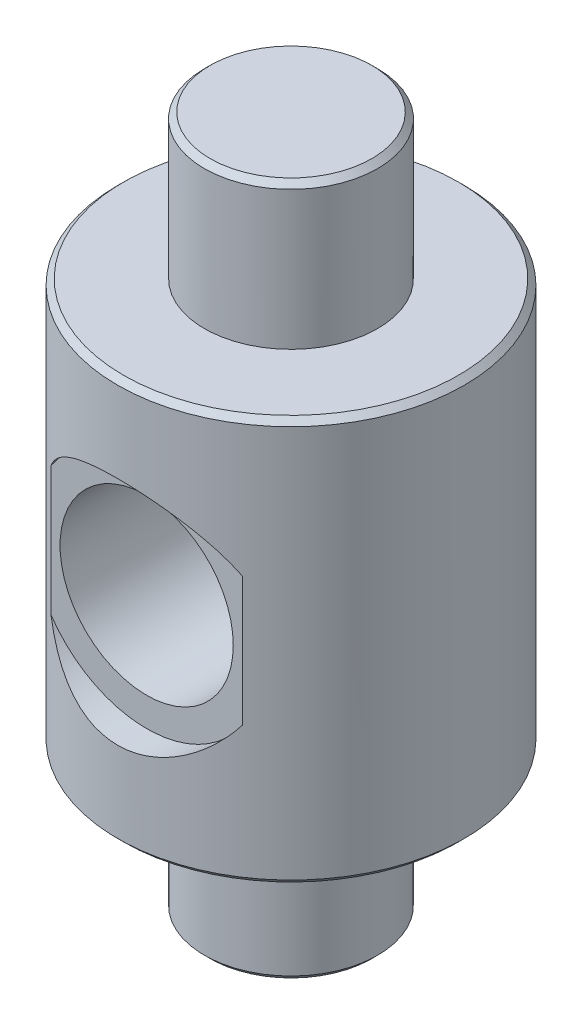
ISO-10303-21;
HEADER;
FILE_DESCRIPTION(('STEP AP214'),'2;1');
FILE_NAME('part.step','',(''),(''),'','','');
FILE_SCHEMA(('AUTOMOTIVE_DESIGN { 1 0 10303 214 1 1 1 1 }'));
ENDSEC;
DATA;
#1=APPLICATION_CONTEXT('core data for automotive mechanical design processes');
#2=APPLICATION_PROTOCOL_DEFINITION('international standard','automotive_design',2000,#1);
#3=PRODUCT_CONTEXT('',#1,'mechanical');
#4=PRODUCT('Part','Part','',(#3));
#5=PRODUCT_RELATED_PRODUCT_CATEGORY('part','',(#4));
#6=PRODUCT_DEFINITION_FORMATION('','',#4);
#7=PRODUCT_DEFINITION_CONTEXT('part definition',#1,'design');
#8=PRODUCT_DEFINITION('design','',#6,#7);
#9=PRODUCT_DEFINITION_SHAPE('','',#8);
#10=(LENGTH_UNIT() NAMED_UNIT(*) SI_UNIT(.MILLI.,.METRE.));
#11=(NAMED_UNIT(*) PLANE_ANGLE_UNIT() SI_UNIT($,.RADIAN.));
#12=(NAMED_UNIT(*) SI_UNIT($,.STERADIAN.) SOLID_ANGLE_UNIT());
#13=UNCERTAINTY_MEASURE_WITH_UNIT(LENGTH_MEASURE(1.E-05),#10,'distance_accuracy_value','');
#14=(GEOMETRIC_REPRESENTATION_CONTEXT(3) GLOBAL_UNCERTAINTY_ASSIGNED_CONTEXT((#13)) GLOBAL_UNIT_ASSIGNED_CONTEXT((#10,
#11,#12)) REPRESENTATION_CONTEXT('',''));
#15=CARTESIAN_POINT('',(0.,0.,0.));
#16=DIRECTION('',(0.,0.,1.));
#17=DIRECTION('',(1.,0.,0.));
#18=AXIS2_PLACEMENT_3D('',#15,#16,#17);
#19=CARTESIAN_POINT('',(0.,0.,0.));
#20=DIRECTION('',(0.,-1.,0.));
#21=DIRECTION('',(0.,0.,-1.));
#22=AXIS2_PLACEMENT_3D('',#19,#20,#21);
#23=CYLINDRICAL_SURFACE('',#22,3.);
#24=CARTESIAN_POINT('',(0.,2.6,0.));
#25=DIRECTION('',(0.,-1.,0.));
#26=DIRECTION('',(0.,0.,-1.));
#27=AXIS2_PLACEMENT_3D('',#24,#25,#26);
#28=CIRCLE('',#27,3.);
#29=CARTESIAN_POINT('',(0.,2.6,-3.));
#30=VERTEX_POINT('',#29);
#31=EDGE_CURVE('E113',#30,#30,#28,.F.);
#32=ORIENTED_EDGE('',*,*,#31,.T.);
#33=EDGE_LOOP('',(#32));
#34=FACE_BOUND('',#33,.T.);
#35=CARTESIAN_POINT('',(0.,9.4,0.));
#36=DIRECTION('',(0.,1.,0.));
#37=DIRECTION('',(0.,0.,1.));
#38=AXIS2_PLACEMENT_3D('',#35,#36,#37);
#39=CIRCLE('',#38,3.);
#40=CARTESIAN_POINT('',(0.,9.4,3.));
#41=VERTEX_POINT('',#40);
#42=EDGE_CURVE('E110',#41,#41,#39,.F.);
#43=ORIENTED_EDGE('',*,*,#42,.T.);
#44=EDGE_LOOP('',(#43));
#45=FACE_BOUND('',#44,.T.);
#46=CARTESIAN_POINT('',(-1.6583123951777,4.88196601125011,2.5));
#47=CARTESIAN_POINT('',(-1.62588041682893,4.83388174951264,2.52151479876285));
#48=CARTESIAN_POINT('',(-1.59147775995563,4.78734838879081,2.54342347636609));
#49=CARTESIAN_POINT('',(-1.51881718972826,4.69748455207734,2.5874697531549));
#50=CARTESIAN_POINT('',(-1.48055809930373,4.65415506101724,2.60960742037181));
#51=CARTESIAN_POINT('',(-1.35957897250648,4.52856680233055,2.67582114663101));
#52=CARTESIAN_POINT('',(-1.27112677213644,4.45140473959464,2.71937159504119));
#53=CARTESIAN_POINT('',(-1.08001742837921,4.31252958225246,2.80078430015006));
#54=CARTESIAN_POINT('',(-0.977318184431943,4.25086385700159,2.83862897767655));
#55=CARTESIAN_POINT('',(-0.760170773384896,4.14620224628185,2.90429124381123));
#56=CARTESIAN_POINT('',(-0.645766459364156,4.103139618855,2.93214461594087));
#57=CARTESIAN_POINT('',(-0.42245729889637,4.04211006134393,2.97201413865436));
#58=CARTESIAN_POINT('',(-0.314455876194935,4.02181009129021,2.98549347454722));
#59=CARTESIAN_POINT('',(-0.0957318708440063,3.99927723884014,3.00046894125686));
#60=CARTESIAN_POINT('',(0.0149896939065672,3.99703769834788,3.00196948813079));
#61=CARTESIAN_POINT('',(0.219788899237258,4.00983152656241,2.99345292695804));
#62=CARTESIAN_POINT('',(0.314087916632492,4.02256428894883,2.98496974119453));
#63=CARTESIAN_POINT('',(0.498831374402182,4.06091145766797,2.95970537418975));
#64=CARTESIAN_POINT('',(0.589276397828324,4.08652390793745,2.94292545299631));
#65=CARTESIAN_POINT('',(0.766037685544138,4.15008299698925,2.90199776264025));
#66=CARTESIAN_POINT('',(0.852235141290288,4.18826615536471,2.87770930064207));
#67=CARTESIAN_POINT('',(1.01715798189846,4.27544067615506,2.8236387306717));
#68=CARTESIAN_POINT('',(1.09587569901238,4.32444296225357,2.79385107537834));
#69=CARTESIAN_POINT('',(1.25565427239454,4.43974414257662,2.72615287516341));
#70=CARTESIAN_POINT('',(1.33541158103129,4.50751898370635,2.68769051048631));
#71=CARTESIAN_POINT('',(1.48295801527083,4.65403199592482,2.60917581519461));
#72=CARTESIAN_POINT('',(1.55076586541565,4.73275266247985,2.56912609477701));
#73=CARTESIAN_POINT('',(1.62799531219028,4.83795848005763,2.51991822969558));
#74=CARTESIAN_POINT('',(1.64336841165434,4.85980271753446,2.5099145043454));
#75=CARTESIAN_POINT('',(1.6583123951777,4.88196601125011,2.5));
#76=B_SPLINE_CURVE_WITH_KNOTS('',3,(#46,#47,#48,#49,#50,#51,#52,#53,#54,#55,#56,#57,#58,#59,#60,
#61,#62,#63,#64,#65,#66,#67,#68,#69,#70,#71,#72,#73,#74,#75),.UNSPECIFIED.,.F.,.F.,(4,2,2,2,2,2,
2,2,2,2,2,2,2,2,4),(0.,0.185463815245249,0.370984410633051,0.744697847347586,1.1195401269487,
1.49302619268151,1.82315350216072,2.1531591024743,2.43842427846838,2.72364614376402,
3.01457448418865,3.30579791879389,3.6390815214847,3.97183814013364,4.05738621739483),.UNSPECIFIED.);
#77=CARTESIAN_POINT('',(-1.6583123951777,4.88196601125011,2.5));
#78=VERTEX_POINT('',#77);
#79=CARTESIAN_POINT('',(1.6583123951777,4.88196601125011,2.5));
#80=VERTEX_POINT('',#79);
#81=EDGE_CURVE('E163',#78,#80,#76,.T.);
#82=ORIENTED_EDGE('',*,*,#81,.F.);
#83=DIRECTION('',(0.,-1.,0.));
#84=VECTOR('',#83,1.);
#85=CARTESIAN_POINT('',(-1.6583123951777,0.,2.5));
#86=LINE('',#85,#84);
#87=CARTESIAN_POINT('',(-1.6583123951777,7.11803398874989,2.5));
#88=VERTEX_POINT('',#87);
#89=EDGE_CURVE('E176',#78,#88,#86,.F.);
#90=ORIENTED_EDGE('',*,*,#89,.T.);
#91=CARTESIAN_POINT('',(1.6583123951777,7.11803398874989,2.5));
#92=CARTESIAN_POINT('',(1.62588041682893,7.16611825048736,2.52151479876285));
#93=CARTESIAN_POINT('',(1.59147775995563,7.21265161120919,2.54342347636609));
#94=CARTESIAN_POINT('',(1.51881718972826,7.30251544792266,2.5874697531549));
#95=CARTESIAN_POINT('',(1.48055809930373,7.34584493898276,2.60960742037181));
#96=CARTESIAN_POINT('',(1.35957897250648,7.47143319766945,2.67582114663101));
#97=CARTESIAN_POINT('',(1.27112677213644,7.54859526040536,2.71937159504119));
#98=CARTESIAN_POINT('',(1.08001742837921,7.68747041774754,2.80078430015006));
#99=CARTESIAN_POINT('',(0.977318184431943,7.74913614299841,2.83862897767655));
#100=CARTESIAN_POINT('',(0.760170773384897,7.85379775371815,2.90429124381123));
#101=CARTESIAN_POINT('',(0.645766459364157,7.896860381145,2.93214461594087));
#102=CARTESIAN_POINT('',(0.422457298896371,7.95788993865607,2.97201413865436));
#103=CARTESIAN_POINT('',(0.314455876194935,7.97818990870978,2.98549347454722));
#104=CARTESIAN_POINT('',(0.0957318708440068,8.00072276115986,3.00046894125686));
#105=CARTESIAN_POINT('',(-0.0149896939065668,8.00296230165212,3.00196948813079));
#106=CARTESIAN_POINT('',(-0.219788899237258,7.9901684734376,2.99345292695804));
#107=CARTESIAN_POINT('',(-0.314087916632492,7.97743571105117,2.98496974119453));
#108=CARTESIAN_POINT('',(-0.498831374402183,7.93908854233203,2.95970537418975));
#109=CARTESIAN_POINT('',(-0.589276397828325,7.91347609206255,2.94292545299631));
#110=CARTESIAN_POINT('',(-0.766037685544138,7.84991700301075,2.90199776264025));
#111=CARTESIAN_POINT('',(-0.852235141290288,7.81173384463529,2.87770930064207));
#112=CARTESIAN_POINT('',(-1.01715798189846,7.72455932384494,2.8236387306717));
#113=CARTESIAN_POINT('',(-1.09587569901238,7.67555703774643,2.79385107537834));
#114=CARTESIAN_POINT('',(-1.25565427239454,7.56025585742338,2.72615287516341));
#115=CARTESIAN_POINT('',(-1.33541158103129,7.49248101629365,2.68769051048631));
#116=CARTESIAN_POINT('',(-1.48295801527083,7.34596800407518,2.60917581519461));
#117=CARTESIAN_POINT('',(-1.55076586541565,7.26724733752015,2.56912609477701));
#118=CARTESIAN_POINT('',(-1.62799531219028,7.16204151994237,2.51991822969558));
#119=CARTESIAN_POINT('',(-1.64336841165434,7.14019728246554,2.5099145043454));
#120=CARTESIAN_POINT('',(-1.6583123951777,7.11803398874989,2.5));
#121=B_SPLINE_CURVE_WITH_KNOTS('',3,(#91,#92,#93,#94,#95,#96,#97,#98,#99,#100,#101,#102,#103,
#104,#105,#106,#107,#108,#109,#110,#111,#112,#113,#114,#115,#116,#117,#118,#119,#120),
.UNSPECIFIED.,.F.,.F.,(4,2,2,2,2,2,2,2,2,2,2,2,2,2,4),(0.,0.185463815245249,0.370984410633051,
0.744697847347586,1.1195401269487,1.49302619268151,1.82315350216072,2.1531591024743,
2.43842427846838,2.72364614376402,3.01457448418865,3.30579791879389,3.6390815214847,
3.97183814013364,4.05738621739483),.UNSPECIFIED.);
#122=CARTESIAN_POINT('',(1.6583123951777,7.11803398874989,2.5));
#123=VERTEX_POINT('',#122);
#124=EDGE_CURVE('E154',#123,#88,#121,.T.);
#125=ORIENTED_EDGE('',*,*,#124,.F.);
#126=DIRECTION('',(0.,-1.,0.));
#127=VECTOR('',#126,1.);
#128=CARTESIAN_POINT('',(1.6583123951777,0.,2.5));
#129=LINE('',#128,#127);
#130=EDGE_CURVE('E340',#123,#80,#129,.T.);
#131=ORIENTED_EDGE('',*,*,#130,.T.);
#132=EDGE_LOOP('',(#82,#90,#125,#131));
#133=FACE_BOUND('',#132,.T.);
#134=DIRECTION('',(0.,-1.,0.));
#135=VECTOR('',#134,1.);
#136=CARTESIAN_POINT('',(1.6583123951777,0.,-2.5));
#137=LINE('',#136,#135);
#138=CARTESIAN_POINT('',(1.6583123951777,4.88196601125011,-2.5));
#139=VERTEX_POINT('',#138);
#140=CARTESIAN_POINT('',(1.6583123951777,7.11803398874989,-2.5));
#141=VERTEX_POINT('',#140);
#142=EDGE_CURVE('E91',#139,#141,#137,.F.);
#143=ORIENTED_EDGE('',*,*,#142,.T.);
#144=CARTESIAN_POINT('',(1.6583123951777,7.11803398874989,-2.5));
#145=CARTESIAN_POINT('',(1.62588041682893,7.16611825048736,-2.52151479876285));
#146=CARTESIAN_POINT('',(1.59147775995563,7.21265161120919,-2.54342347636609));
#147=CARTESIAN_POINT('',(1.51881718972826,7.30251544792266,-2.5874697531549));
#148=CARTESIAN_POINT('',(1.48055809930373,7.34584493898276,-2.60960742037181));
#149=CARTESIAN_POINT('',(1.35957897250648,7.47143319766945,-2.67582114663101));
#150=CARTESIAN_POINT('',(1.27112677213644,7.54859526040536,-2.71937159504119));
#151=CARTESIAN_POINT('',(1.08001742837921,7.68747041774754,-2.80078430015006));
#152=CARTESIAN_POINT('',(0.977318184431943,7.74913614299841,-2.83862897767655));
#153=CARTESIAN_POINT('',(0.760170773384897,7.85379775371815,-2.90429124381123));
#154=CARTESIAN_POINT('',(0.645766459364157,7.896860381145,-2.93214461594087));
#155=CARTESIAN_POINT('',(0.422457298896371,7.95788993865607,-2.97201413865436));
#156=CARTESIAN_POINT('',(0.314455876194935,7.97818990870978,-2.98549347454722));
#157=CARTESIAN_POINT('',(0.0957318708440068,8.00072276115986,-3.00046894125686));
#158=CARTESIAN_POINT('',(-0.0149896939065668,8.00296230165212,-3.00196948813079));
#159=CARTESIAN_POINT('',(-0.219788899237258,7.9901684734376,-2.99345292695804));
#160=CARTESIAN_POINT('',(-0.314087916632492,7.97743571105117,-2.98496974119453));
#161=CARTESIAN_POINT('',(-0.498831374402183,7.93908854233203,-2.95970537418975));
#162=CARTESIAN_POINT('',(-0.589276397828325,7.91347609206255,-2.94292545299631));
#163=CARTESIAN_POINT('',(-0.766037685544138,7.84991700301075,-2.90199776264025));
#164=CARTESIAN_POINT('',(-0.852235141290288,7.81173384463529,-2.87770930064207));
#165=CARTESIAN_POINT('',(-1.01715798189846,7.72455932384494,-2.8236387306717));
#166=CARTESIAN_POINT('',(-1.09587569901238,7.67555703774643,-2.79385107537834));
#167=CARTESIAN_POINT('',(-1.25565427239454,7.56025585742338,-2.72615287516341));
#168=CARTESIAN_POINT('',(-1.33541158103129,7.49248101629365,-2.68769051048631));
#169=CARTESIAN_POINT('',(-1.48295801527083,7.34596800407518,-2.60917581519461));
#170=CARTESIAN_POINT('',(-1.55076586541565,7.26724733752015,-2.56912609477701));
#171=CARTESIAN_POINT('',(-1.62799531219028,7.16204151994237,-2.51991822969558));
#172=CARTESIAN_POINT('',(-1.64336841165434,7.14019728246554,-2.5099145043454));
#173=CARTESIAN_POINT('',(-1.6583123951777,7.11803398874989,-2.5));
#174=B_SPLINE_CURVE_WITH_KNOTS('',3,(#144,#145,#146,#147,#148,#149,#150,#151,#152,#153,#154,
#155,#156,#157,#158,#159,#160,#161,#162,#163,#164,#165,#166,#167,#168,#169,#170,#171,#172,#173),
.UNSPECIFIED.,.F.,.F.,(4,2,2,2,2,2,2,2,2,2,2,2,2,2,4),(0.,0.185463815245249,0.370984410633051,
0.744697847347586,1.1195401269487,1.49302619268151,1.82315350216072,2.1531591024743,
2.43842427846838,2.72364614376402,3.01457448418865,3.30579791879389,3.6390815214847,
3.97183814013364,4.05738621739483),.UNSPECIFIED.);
#175=CARTESIAN_POINT('',(-1.6583123951777,7.11803398874989,-2.5));
#176=VERTEX_POINT('',#175);
#177=EDGE_CURVE('E80',#141,#176,#174,.T.);
#178=ORIENTED_EDGE('',*,*,#177,.T.);
#179=DIRECTION('',(0.,-1.,0.));
#180=VECTOR('',#179,1.);
#181=CARTESIAN_POINT('',(-1.6583123951777,0.,-2.5));
#182=LINE('',#181,#180);
#183=CARTESIAN_POINT('',(-1.6583123951777,4.88196601125011,-2.5));
#184=VERTEX_POINT('',#183);
#185=EDGE_CURVE('E87',#176,#184,#182,.T.);
#186=ORIENTED_EDGE('',*,*,#185,.T.);
#187=CARTESIAN_POINT('',(-1.6583123951777,4.88196601125011,-2.5));
#188=CARTESIAN_POINT('',(-1.62588041682893,4.83388174951264,-2.52151479876285));
#189=CARTESIAN_POINT('',(-1.59147775995563,4.78734838879081,-2.54342347636609));
#190=CARTESIAN_POINT('',(-1.51881718972826,4.69748455207734,-2.5874697531549));
#191=CARTESIAN_POINT('',(-1.48055809930373,4.65415506101724,-2.60960742037181));
#192=CARTESIAN_POINT('',(-1.35957897250648,4.52856680233055,-2.67582114663101));
#193=CARTESIAN_POINT('',(-1.27112677213644,4.45140473959464,-2.71937159504119));
#194=CARTESIAN_POINT('',(-1.08001742837921,4.31252958225246,-2.80078430015006));
#195=CARTESIAN_POINT('',(-0.977318184431943,4.25086385700159,-2.83862897767655));
#196=CARTESIAN_POINT('',(-0.760170773384896,4.14620224628185,-2.90429124381123));
#197=CARTESIAN_POINT('',(-0.645766459364156,4.103139618855,-2.93214461594087));
#198=CARTESIAN_POINT('',(-0.42245729889637,4.04211006134393,-2.97201413865436));
#199=CARTESIAN_POINT('',(-0.314455876194935,4.02181009129021,-2.98549347454722));
#200=CARTESIAN_POINT('',(-0.0957318708440063,3.99927723884014,-3.00046894125686));
#201=CARTESIAN_POINT('',(0.0149896939065672,3.99703769834788,-3.00196948813079));
#202=CARTESIAN_POINT('',(0.219788899237258,4.00983152656241,-2.99345292695804));
#203=CARTESIAN_POINT('',(0.314087916632492,4.02256428894883,-2.98496974119453));
#204=CARTESIAN_POINT('',(0.498831374402182,4.06091145766797,-2.95970537418975));
#205=CARTESIAN_POINT('',(0.589276397828324,4.08652390793745,-2.94292545299631));
#206=CARTESIAN_POINT('',(0.766037685544138,4.15008299698925,-2.90199776264025));
#207=CARTESIAN_POINT('',(0.852235141290288,4.18826615536471,-2.87770930064207));
#208=CARTESIAN_POINT('',(1.01715798189846,4.27544067615506,-2.8236387306717));
#209=CARTESIAN_POINT('',(1.09587569901238,4.32444296225357,-2.79385107537834));
#210=CARTESIAN_POINT('',(1.25565427239454,4.43974414257662,-2.72615287516341));
#211=CARTESIAN_POINT('',(1.33541158103129,4.50751898370635,-2.68769051048631));
#212=CARTESIAN_POINT('',(1.48295801527083,4.65403199592482,-2.60917581519461));
#213=CARTESIAN_POINT('',(1.55076586541565,4.73275266247985,-2.56912609477701));
#214=CARTESIAN_POINT('',(1.62799531219028,4.83795848005763,-2.51991822969558));
#215=CARTESIAN_POINT('',(1.64336841165434,4.85980271753446,-2.5099145043454));
#216=CARTESIAN_POINT('',(1.6583123951777,4.88196601125011,-2.5));
#217=B_SPLINE_CURVE_WITH_KNOTS('',3,(#187,#188,#189,#190,#191,#192,#193,#194,#195,#196,#197,
#198,#199,#200,#201,#202,#203,#204,#205,#206,#207,#208,#209,#210,#211,#212,#213,#214,#215,#216),
.UNSPECIFIED.,.F.,.F.,(4,2,2,2,2,2,2,2,2,2,2,2,2,2,4),(0.,0.185463815245249,0.370984410633051,
0.744697847347586,1.1195401269487,1.49302619268151,1.82315350216072,2.1531591024743,
2.43842427846838,2.72364614376402,3.01457448418865,3.30579791879389,3.6390815214847,
3.97183814013364,4.05738621739483),.UNSPECIFIED.);
#218=EDGE_CURVE('E50',#184,#139,#217,.T.);
#219=ORIENTED_EDGE('',*,*,#218,.T.);
#220=EDGE_LOOP('',(#143,#178,#186,#219));
#221=FACE_BOUND('',#220,.T.);
#222=ADVANCED_FACE('F35',(#34,#45,#133,#221),#23,.T.);
#223=CARTESIAN_POINT('',(1.5,0.,0.));
#224=DIRECTION('',(0.,-1.,0.));
#225=DIRECTION('',(0.,0.,-1.));
#226=AXIS2_PLACEMENT_3D('',#223,#224,#225);
#227=PLANE('',#226);
#228=CARTESIAN_POINT('',(0.,0.,0.));
#229=DIRECTION('',(0.,-1.,0.));
#230=DIRECTION('',(0.,0.,-1.));
#231=AXIS2_PLACEMENT_3D('',#228,#229,#230);
#232=CIRCLE('',#231,1.4);
#233=CARTESIAN_POINT('',(0.,0.,-1.4));
#234=VERTEX_POINT('',#233);
#235=EDGE_CURVE('E94',#234,#234,#232,.T.);
#236=ORIENTED_EDGE('',*,*,#235,.T.);
#237=EDGE_LOOP('',(#236));
#238=FACE_BOUND('',#237,.T.);
#239=ADVANCED_FACE('F134',(#238),#227,.T.);
#240=CARTESIAN_POINT('',(0.,12.,0.));
#241=DIRECTION('',(0.,1.,0.));
#242=DIRECTION('',(0.,0.,1.));
#243=AXIS2_PLACEMENT_3D('',#240,#241,#242);
#244=PLANE('',#243);
#245=CARTESIAN_POINT('',(0.,12.,0.));
#246=DIRECTION('',(0.,1.,0.));
#247=DIRECTION('',(0.,0.,1.));
#248=AXIS2_PLACEMENT_3D('',#245,#246,#247);
#249=CIRCLE('',#248,1.4);
#250=CARTESIAN_POINT('',(0.,12.,1.4));
#251=VERTEX_POINT('',#250);
#252=EDGE_CURVE('E11',#251,#251,#249,.T.);
#253=ORIENTED_EDGE('',*,*,#252,.T.);
#254=EDGE_LOOP('',(#253));
#255=FACE_BOUND('',#254,.T.);
#256=ADVANCED_FACE('F140',(#255),#244,.T.);
#257=CARTESIAN_POINT('',(0.,0.,0.));
#258=DIRECTION('',(0.,-1.,0.));
#259=DIRECTION('',(0.,0.,-1.));
#260=AXIS2_PLACEMENT_3D('',#257,#258,#259);
#261=CYLINDRICAL_SURFACE('',#260,1.5);
#262=CARTESIAN_POINT('',(0.,11.9,0.));
#263=DIRECTION('',(0.,1.,0.));
#264=DIRECTION('',(0.,0.,1.));
#265=AXIS2_PLACEMENT_3D('',#262,#263,#264);
#266=CIRCLE('',#265,1.5);
#267=CARTESIAN_POINT('',(0.,11.9,1.5));
#268=VERTEX_POINT('',#267);
#269=EDGE_CURVE('E44',#268,#268,#266,.F.);
#270=ORIENTED_EDGE('',*,*,#269,.T.);
#271=EDGE_LOOP('',(#270));
#272=FACE_BOUND('',#271,.T.);
#273=CARTESIAN_POINT('',(0.,9.5,0.));
#274=DIRECTION('',(0.,-1.,0.));
#275=DIRECTION('',(0.,0.,-1.));
#276=AXIS2_PLACEMENT_3D('',#273,#274,#275);
#277=CIRCLE('',#276,1.5);
#278=CARTESIAN_POINT('',(0.,9.5,-1.5));
#279=VERTEX_POINT('',#278);
#280=EDGE_CURVE('E212',#279,#279,#277,.T.);
#281=ORIENTED_EDGE('',*,*,#280,.F.);
#282=EDGE_LOOP('',(#281));
#283=FACE_BOUND('',#282,.T.);
#284=ADVANCED_FACE('F121',(#272,#283),#261,.T.);
#285=CARTESIAN_POINT('',(1.5,9.5,0.));
#286=DIRECTION('',(0.,1.,0.));
#287=DIRECTION('',(0.,0.,1.));
#288=AXIS2_PLACEMENT_3D('',#285,#286,#287);
#289=PLANE('',#288);
#290=CARTESIAN_POINT('',(0.,9.5,0.));
#291=DIRECTION('',(0.,1.,0.));
#292=DIRECTION('',(0.,0.,1.));
#293=AXIS2_PLACEMENT_3D('',#290,#291,#292);
#294=CIRCLE('',#293,2.9);
#295=CARTESIAN_POINT('',(0.,9.5,2.9));
#296=VERTEX_POINT('',#295);
#297=EDGE_CURVE('E116',#296,#296,#294,.T.);
#298=ORIENTED_EDGE('',*,*,#297,.T.);
#299=EDGE_LOOP('',(#298));
#300=FACE_BOUND('',#299,.T.);
#301=ORIENTED_EDGE('',*,*,#280,.T.);
#302=EDGE_LOOP('',(#301));
#303=FACE_BOUND('',#302,.T.);
#304=ADVANCED_FACE('F149',(#300,#303),#289,.T.);
#305=CARTESIAN_POINT('',(3.,2.5,0.));
#306=DIRECTION('',(0.,-1.,0.));
#307=DIRECTION('',(0.,0.,-1.));
#308=AXIS2_PLACEMENT_3D('',#305,#306,#307);
#309=PLANE('',#308);
#310=CARTESIAN_POINT('',(0.,2.5,0.));
#311=DIRECTION('',(0.,-1.,0.));
#312=DIRECTION('',(0.,0.,-1.));
#313=AXIS2_PLACEMENT_3D('',#310,#311,#312);
#314=CIRCLE('',#313,2.9);
#315=CARTESIAN_POINT('',(0.,2.5,-2.9));
#316=VERTEX_POINT('',#315);
#317=EDGE_CURVE('E107',#316,#316,#314,.T.);
#318=ORIENTED_EDGE('',*,*,#317,.T.);
#319=EDGE_LOOP('',(#318));
#320=FACE_BOUND('',#319,.T.);
#321=CARTESIAN_POINT('',(0.,2.5,0.));
#322=DIRECTION('',(0.,-1.,0.));
#323=DIRECTION('',(0.,0.,-1.));
#324=AXIS2_PLACEMENT_3D('',#321,#322,#323);
#325=CIRCLE('',#324,1.5);
#326=CARTESIAN_POINT('',(0.,2.5,-1.5));
#327=VERTEX_POINT('',#326);
#328=EDGE_CURVE('E210',#327,#327,#325,.T.);
#329=ORIENTED_EDGE('',*,*,#328,.F.);
#330=EDGE_LOOP('',(#329));
#331=FACE_BOUND('',#330,.T.);
#332=ADVANCED_FACE('F147',(#320,#331),#309,.T.);
#333=CARTESIAN_POINT('',(0.,0.,0.));
#334=DIRECTION('',(0.,-1.,0.));
#335=DIRECTION('',(0.,0.,-1.));
#336=AXIS2_PLACEMENT_3D('',#333,#334,#335);
#337=CYLINDRICAL_SURFACE('',#336,1.5);
#338=CARTESIAN_POINT('',(0.,0.0999999999999985,0.));
#339=DIRECTION('',(0.,-1.,0.));
#340=DIRECTION('',(0.,0.,-1.));
#341=AXIS2_PLACEMENT_3D('',#338,#339,#340);
#342=CIRCLE('',#341,1.5);
#343=CARTESIAN_POINT('',(0.,0.0999999999999985,-1.5));
#344=VERTEX_POINT('',#343);
#345=EDGE_CURVE('E97',#344,#344,#342,.F.);
#346=ORIENTED_EDGE('',*,*,#345,.T.);
#347=EDGE_LOOP('',(#346));
#348=FACE_BOUND('',#347,.T.);
#349=ORIENTED_EDGE('',*,*,#328,.T.);
#350=EDGE_LOOP('',(#349));
#351=FACE_BOUND('',#350,.T.);
#352=ADVANCED_FACE('F196',(#348,#351),#337,.T.);
#353=CARTESIAN_POINT('',(0.,6.,2.5));
#354=DIRECTION('',(0.,0.,1.));
#355=DIRECTION('',(1.,0.,0.));
#356=AXIS2_PLACEMENT_3D('',#353,#354,#355);
#357=CYLINDRICAL_SURFACE('',#356,2.);
#358=CARTESIAN_POINT('',(0.,6.,2.5));
#359=DIRECTION('',(0.,0.,1.));
#360=DIRECTION('',(1.,0.,0.));
#361=AXIS2_PLACEMENT_3D('',#358,#359,#360);
#362=CIRCLE('',#361,2.);
#363=EDGE_CURVE('E58',#78,#80,#362,.T.);
#364=ORIENTED_EDGE('',*,*,#363,.F.);
#365=ORIENTED_EDGE('',*,*,#81,.T.);
#366=EDGE_LOOP('',(#364,#365));
#367=FACE_BOUND('',#366,.T.);
#368=ADVANCED_FACE('F194',(#367),#357,.F.);
#369=EDGE_CURVE('E213',#123,#88,#362,.T.);
#370=ORIENTED_EDGE('',*,*,#369,.F.);
#371=ORIENTED_EDGE('',*,*,#124,.T.);
#372=EDGE_LOOP('',(#370,#371));
#373=FACE_BOUND('',#372,.T.);
#374=ADVANCED_FACE('F190',(#373),#357,.F.);
#375=CARTESIAN_POINT('',(0.,6.,2.5));
#376=DIRECTION('',(0.,0.,1.));
#377=DIRECTION('',(1.,0.,0.));
#378=AXIS2_PLACEMENT_3D('',#375,#376,#377);
#379=PLANE('',#378);
#380=CARTESIAN_POINT('',(0.,6.,2.5));
#381=DIRECTION('',(0.,0.,1.));
#382=DIRECTION('',(1.,0.,0.));
#383=AXIS2_PLACEMENT_3D('',#380,#381,#382);
#384=CIRCLE('',#383,1.5);
#385=CARTESIAN_POINT('',(1.5,6.,2.5));
#386=VERTEX_POINT('',#385);
#387=EDGE_CURVE('E103',#386,#386,#384,.T.);
#388=ORIENTED_EDGE('',*,*,#387,.F.);
#389=EDGE_LOOP('',(#388));
#390=FACE_BOUND('',#389,.T.);
#391=ORIENTED_EDGE('',*,*,#363,.T.);
#392=ORIENTED_EDGE('',*,*,#130,.F.);
#393=ORIENTED_EDGE('',*,*,#369,.T.);
#394=ORIENTED_EDGE('',*,*,#89,.F.);
#395=EDGE_LOOP('',(#391,#392,#393,#394));
#396=FACE_BOUND('',#395,.T.);
#397=ADVANCED_FACE('F187',(#390,#396),#379,.T.);
#398=CARTESIAN_POINT('',(0.,6.,-2.5));
#399=DIRECTION('',(0.,0.,-1.));
#400=DIRECTION('',(-1.,0.,0.));
#401=AXIS2_PLACEMENT_3D('',#398,#399,#400);
#402=CYLINDRICAL_SURFACE('',#401,2.);
#403=CARTESIAN_POINT('',(0.,6.,-2.5));
#404=DIRECTION('',(0.,0.,1.));
#405=DIRECTION('',(1.,0.,0.));
#406=AXIS2_PLACEMENT_3D('',#403,#404,#405);
#407=CIRCLE('',#406,2.);
#408=EDGE_CURVE('E83',#141,#176,#407,.T.);
#409=ORIENTED_EDGE('',*,*,#408,.T.);
#410=ORIENTED_EDGE('',*,*,#177,.F.);
#411=EDGE_LOOP('',(#409,#410));
#412=FACE_BOUND('',#411,.T.);
#413=ADVANCED_FACE('F82',(#412),#402,.F.);
#414=EDGE_CURVE('E92',#184,#139,#407,.T.);
#415=ORIENTED_EDGE('',*,*,#414,.T.);
#416=ORIENTED_EDGE('',*,*,#218,.F.);
#417=EDGE_LOOP('',(#415,#416));
#418=FACE_BOUND('',#417,.T.);
#419=ADVANCED_FACE('F181',(#418),#402,.F.);
#420=CARTESIAN_POINT('',(0.,6.,-2.5));
#421=DIRECTION('',(0.,0.,-1.));
#422=DIRECTION('',(1.,0.,0.));
#423=AXIS2_PLACEMENT_3D('',#420,#421,#422);
#424=PLANE('',#423);
#425=CARTESIAN_POINT('',(0.,6.,-2.5));
#426=DIRECTION('',(0.,0.,-1.));
#427=DIRECTION('',(-1.,0.,0.));
#428=AXIS2_PLACEMENT_3D('',#425,#426,#427);
#429=CIRCLE('',#428,1.5);
#430=CARTESIAN_POINT('',(-1.5,6.,-2.5));
#431=VERTEX_POINT('',#430);
#432=EDGE_CURVE('E101',#431,#431,#429,.T.);
#433=ORIENTED_EDGE('',*,*,#432,.F.);
#434=EDGE_LOOP('',(#433));
#435=FACE_BOUND('',#434,.T.);
#436=ORIENTED_EDGE('',*,*,#414,.F.);
#437=ORIENTED_EDGE('',*,*,#185,.F.);
#438=ORIENTED_EDGE('',*,*,#408,.F.);
#439=ORIENTED_EDGE('',*,*,#142,.F.);
#440=EDGE_LOOP('',(#436,#437,#438,#439));
#441=FACE_BOUND('',#440,.T.);
#442=ADVANCED_FACE('F90',(#435,#441),#424,.T.);
#443=CARTESIAN_POINT('',(0.,6.,-3.));
#444=DIRECTION('',(0.,0.,1.));
#445=DIRECTION('',(1.,0.,0.));
#446=AXIS2_PLACEMENT_3D('',#443,#444,#445);
#447=CYLINDRICAL_SURFACE('',#446,1.5);
#448=ORIENTED_EDGE('',*,*,#432,.T.);
#449=EDGE_LOOP('',(#448));
#450=FACE_BOUND('',#449,.T.);
#451=ORIENTED_EDGE('',*,*,#387,.T.);
#452=EDGE_LOOP('',(#451));
#453=FACE_BOUND('',#452,.T.);
#454=ADVANCED_FACE('F222',(#450,#453),#447,.F.);
#455=CARTESIAN_POINT('',(0.,0.,0.));
#456=DIRECTION('',(0.,1.,0.));
#457=DIRECTION('',(0.,0.,1.));
#458=AXIS2_PLACEMENT_3D('',#455,#456,#457);
#459=CONICAL_SURFACE('',#458,1.4,0.785398163397451);
#460=ORIENTED_EDGE('',*,*,#345,.F.);
#461=EDGE_LOOP('',(#460));
#462=FACE_BOUND('',#461,.T.);
#463=ORIENTED_EDGE('',*,*,#235,.F.);
#464=EDGE_LOOP('',(#463));
#465=FACE_BOUND('',#464,.T.);
#466=ADVANCED_FACE('F224',(#462,#465),#459,.T.);
#467=CARTESIAN_POINT('',(0.,2.5,0.));
#468=DIRECTION('',(0.,1.,0.));
#469=DIRECTION('',(0.,0.,1.));
#470=AXIS2_PLACEMENT_3D('',#467,#468,#469);
#471=CONICAL_SURFACE('',#470,2.9,0.785398163397446);
#472=ORIENTED_EDGE('',*,*,#31,.F.);
#473=EDGE_LOOP('',(#472));
#474=FACE_BOUND('',#473,.T.);
#475=ORIENTED_EDGE('',*,*,#317,.F.);
#476=EDGE_LOOP('',(#475));
#477=FACE_BOUND('',#476,.T.);
#478=ADVANCED_FACE('F130',(#474,#477),#471,.T.);
#479=CARTESIAN_POINT('',(0.,9.4,0.));
#480=DIRECTION('',(0.,-1.,0.));
#481=DIRECTION('',(0.,0.,-1.));
#482=AXIS2_PLACEMENT_3D('',#479,#480,#481);
#483=CONICAL_SURFACE('',#482,3.,0.785398163397453);
#484=ORIENTED_EDGE('',*,*,#297,.F.);
#485=EDGE_LOOP('',(#484));
#486=FACE_BOUND('',#485,.T.);
#487=ORIENTED_EDGE('',*,*,#42,.F.);
#488=EDGE_LOOP('',(#487));
#489=FACE_BOUND('',#488,.T.);
#490=ADVANCED_FACE('F125',(#486,#489),#483,.T.);
#491=CARTESIAN_POINT('',(0.,11.9,0.));
#492=DIRECTION('',(0.,-1.,0.));
#493=DIRECTION('',(0.,0.,-1.));
#494=AXIS2_PLACEMENT_3D('',#491,#492,#493);
#495=CONICAL_SURFACE('',#494,1.5,0.785398163397452);
#496=ORIENTED_EDGE('',*,*,#252,.F.);
#497=EDGE_LOOP('',(#496));
#498=FACE_BOUND('',#497,.T.);
#499=ORIENTED_EDGE('',*,*,#269,.F.);
#500=EDGE_LOOP('',(#499));
#501=FACE_BOUND('',#500,.T.);
#502=ADVANCED_FACE('F38',(#498,#501),#495,.T.);
#503=CLOSED_SHELL('',(#222,#239,#256,#284,#304,#332,#352,#368,#374,#397,#413,#419,#442,#454,
#466,#478,#490,#502));
#504=MANIFOLD_SOLID_BREP('B2',#503);
#505=ADVANCED_BREP_SHAPE_REPRESENTATION('',(#18,#504),#14);
#506=SHAPE_DEFINITION_REPRESENTATION(#9,#505);
ENDSEC;
END-ISO-10303-21;
